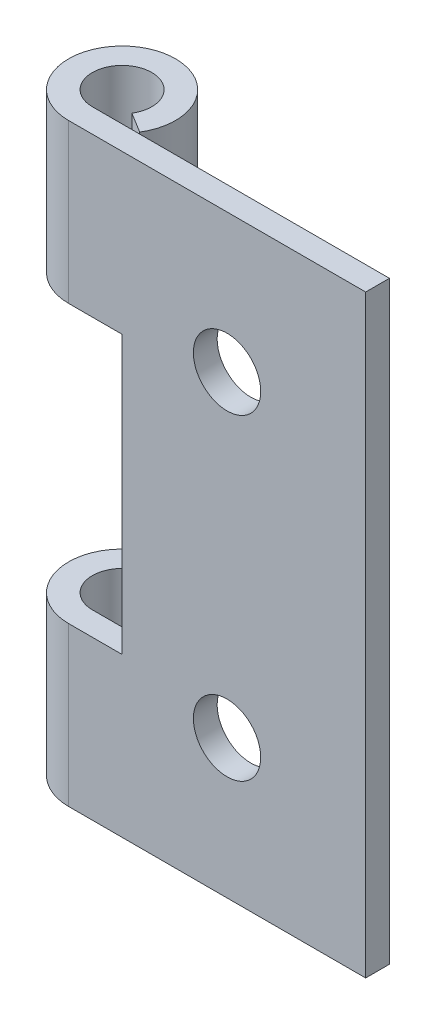
ISO-10303-21;
HEADER;
FILE_DESCRIPTION(('STEP AP214'),'2;1');
FILE_NAME('part.step','',(''),(''),'','','');
FILE_SCHEMA(('AUTOMOTIVE_DESIGN { 1 0 10303 214 1 1 1 1 }'));
ENDSEC;
DATA;
#1=APPLICATION_CONTEXT('core data for automotive mechanical design processes');
#2=APPLICATION_PROTOCOL_DEFINITION('international standard','automotive_design',2000,#1);
#3=PRODUCT_CONTEXT('',#1,'mechanical');
#4=PRODUCT('Part','Part','',(#3));
#5=PRODUCT_RELATED_PRODUCT_CATEGORY('part','',(#4));
#6=PRODUCT_DEFINITION_FORMATION('','',#4);
#7=PRODUCT_DEFINITION_CONTEXT('part definition',#1,'design');
#8=PRODUCT_DEFINITION('design','',#6,#7);
#9=PRODUCT_DEFINITION_SHAPE('','',#8);
#10=(LENGTH_UNIT() NAMED_UNIT(*) SI_UNIT(.MILLI.,.METRE.));
#11=(NAMED_UNIT(*) PLANE_ANGLE_UNIT() SI_UNIT($,.RADIAN.));
#12=(NAMED_UNIT(*) SI_UNIT($,.STERADIAN.) SOLID_ANGLE_UNIT());
#13=UNCERTAINTY_MEASURE_WITH_UNIT(LENGTH_MEASURE(1.E-05),#10,'distance_accuracy_value','');
#14=(GEOMETRIC_REPRESENTATION_CONTEXT(3) GLOBAL_UNCERTAINTY_ASSIGNED_CONTEXT((#13)) GLOBAL_UNIT_ASSIGNED_CONTEXT((#10,
#11,#12)) REPRESENTATION_CONTEXT('',''));
#15=CARTESIAN_POINT('',(0.,0.,0.));
#16=DIRECTION('',(0.,0.,1.));
#17=DIRECTION('',(1.,0.,0.));
#18=AXIS2_PLACEMENT_3D('',#15,#16,#17);
#19=CARTESIAN_POINT('',(0.,-30.,0.599999999999999));
#20=DIRECTION('',(0.,0.,1.));
#21=DIRECTION('',(1.,0.,0.));
#22=AXIS2_PLACEMENT_3D('',#19,#20,#21);
#23=PLANE('',#22);
#24=CARTESIAN_POINT('',(8.,-23.,0.599999999999999));
#25=DIRECTION('',(0.,0.,-1.));
#26=DIRECTION('',(-1.,0.,0.));
#27=AXIS2_PLACEMENT_3D('',#24,#25,#26);
#28=CIRCLE('',#27,1.7);
#29=CARTESIAN_POINT('',(6.3,-23.,0.599999999999999));
#30=VERTEX_POINT('',#29);
#31=EDGE_CURVE('E208',#30,#30,#28,.T.);
#32=ORIENTED_EDGE('',*,*,#31,.T.);
#33=EDGE_LOOP('',(#32));
#34=FACE_BOUND('',#33,.T.);
#35=CARTESIAN_POINT('',(8.,-7.,0.599999999999999));
#36=DIRECTION('',(0.,0.,-1.));
#37=DIRECTION('',(-1.,0.,0.));
#38=AXIS2_PLACEMENT_3D('',#35,#36,#37);
#39=CIRCLE('',#38,1.7);
#40=CARTESIAN_POINT('',(6.3,-7.,0.599999999999999));
#41=VERTEX_POINT('',#40);
#42=EDGE_CURVE('E250',#41,#41,#39,.T.);
#43=ORIENTED_EDGE('',*,*,#42,.T.);
#44=EDGE_LOOP('',(#43));
#45=FACE_BOUND('',#44,.T.);
#46=DIRECTION('',(0.,1.,0.));
#47=VECTOR('',#46,1.);
#48=CARTESIAN_POINT('',(0.,-30.,0.599999999999999));
#49=LINE('',#48,#47);
#50=CARTESIAN_POINT('',(0.,-8.,0.599999999999999));
#51=VERTEX_POINT('',#50);
#52=CARTESIAN_POINT('',(0.,0.,0.599999999999999));
#53=VERTEX_POINT('',#52);
#54=EDGE_CURVE('E122',#51,#53,#49,.T.);
#55=ORIENTED_EDGE('',*,*,#54,.F.);
#56=DIRECTION('',(-1.,0.,0.));
#57=VECTOR('',#56,1.);
#58=CARTESIAN_POINT('',(0.,-8.,0.599999999999999));
#59=LINE('',#58,#57);
#60=CARTESIAN_POINT('',(2.7,-8.,0.599999999999999));
#61=VERTEX_POINT('',#60);
#62=EDGE_CURVE('E184',#61,#51,#59,.T.);
#63=ORIENTED_EDGE('',*,*,#62,.F.);
#64=DIRECTION('',(0.,-1.,0.));
#65=VECTOR('',#64,1.);
#66=CARTESIAN_POINT('',(2.7,-8.,0.599999999999999));
#67=LINE('',#66,#65);
#68=CARTESIAN_POINT('',(2.7,-22.,0.599999999999999));
#69=VERTEX_POINT('',#68);
#70=EDGE_CURVE('E147',#61,#69,#67,.T.);
#71=ORIENTED_EDGE('',*,*,#70,.T.);
#72=DIRECTION('',(-1.,0.,0.));
#73=VECTOR('',#72,1.);
#74=CARTESIAN_POINT('',(0.,-22.,0.599999999999999));
#75=LINE('',#74,#73);
#76=CARTESIAN_POINT('',(0.,-22.,0.599999999999999));
#77=VERTEX_POINT('',#76);
#78=EDGE_CURVE('E211',#69,#77,#75,.T.);
#79=ORIENTED_EDGE('',*,*,#78,.T.);
#80=CARTESIAN_POINT('',(0.,-30.,0.599999999999999));
#81=VERTEX_POINT('',#80);
#82=EDGE_CURVE('E48',#81,#77,#49,.T.);
#83=ORIENTED_EDGE('',*,*,#82,.F.);
#84=DIRECTION('',(1.,0.,0.));
#85=VECTOR('',#84,1.);
#86=CARTESIAN_POINT('',(0.,-30.,0.599999999999999));
#87=LINE('',#86,#85);
#88=CARTESIAN_POINT('',(15.,-30.,0.599999999999998));
#89=VERTEX_POINT('',#88);
#90=EDGE_CURVE('E131',#81,#89,#87,.T.);
#91=ORIENTED_EDGE('',*,*,#90,.T.);
#92=DIRECTION('',(0.,1.,0.));
#93=VECTOR('',#92,1.);
#94=CARTESIAN_POINT('',(15.,-30.,0.599999999999998));
#95=LINE('',#94,#93);
#96=CARTESIAN_POINT('',(15.,0.,0.599999999999998));
#97=VERTEX_POINT('',#96);
#98=EDGE_CURVE('E11',#89,#97,#95,.T.);
#99=ORIENTED_EDGE('',*,*,#98,.T.);
#100=DIRECTION('',(1.,0.,0.));
#101=VECTOR('',#100,1.);
#102=CARTESIAN_POINT('',(0.,0.,0.599999999999999));
#103=LINE('',#102,#101);
#104=EDGE_CURVE('E159',#53,#97,#103,.T.);
#105=ORIENTED_EDGE('',*,*,#104,.F.);
#106=EDGE_LOOP('',(#55,#63,#71,#79,#83,#91,#99,#105));
#107=FACE_BOUND('',#106,.T.);
#108=ADVANCED_FACE('F39',(#34,#45,#107),#23,.T.);
#109=CARTESIAN_POINT('',(0.,-30.,-2.1));
#110=DIRECTION('',(0.,1.,0.));
#111=DIRECTION('',(0.,0.,1.));
#112=AXIS2_PLACEMENT_3D('',#109,#110,#111);
#113=CYLINDRICAL_SURFACE('',#112,2.7);
#114=DIRECTION('',(0.,1.,0.));
#115=VECTOR('',#114,1.);
#116=CARTESIAN_POINT('',(2.30184189566561,-30.,-0.688786377844038));
#117=LINE('',#116,#115);
#118=CARTESIAN_POINT('',(2.30184189566561,-8.,-0.688786377844038));
#119=VERTEX_POINT('',#118);
#120=CARTESIAN_POINT('',(2.30184189566561,0.,-0.688786377844038));
#121=VERTEX_POINT('',#120);
#122=EDGE_CURVE('E123',#119,#121,#117,.T.);
#123=ORIENTED_EDGE('',*,*,#122,.F.);
#124=CARTESIAN_POINT('',(0.,-8.,-2.1));
#125=DIRECTION('',(0.,-1.,0.));
#126=DIRECTION('',(0.,0.,-1.));
#127=AXIS2_PLACEMENT_3D('',#124,#125,#126);
#128=CIRCLE('',#127,2.7);
#129=EDGE_CURVE('E192',#51,#119,#128,.T.);
#130=ORIENTED_EDGE('',*,*,#129,.F.);
#131=ORIENTED_EDGE('',*,*,#54,.T.);
#132=CARTESIAN_POINT('',(0.,0.,-2.1));
#133=DIRECTION('',(0.,1.,0.));
#134=DIRECTION('',(0.,0.,1.));
#135=AXIS2_PLACEMENT_3D('',#132,#133,#134);
#136=CIRCLE('',#135,2.7);
#137=EDGE_CURVE('E156',#121,#53,#136,.T.);
#138=ORIENTED_EDGE('',*,*,#137,.F.);
#139=EDGE_LOOP('',(#123,#130,#131,#138));
#140=FACE_BOUND('',#139,.T.);
#141=ADVANCED_FACE('F190',(#140),#113,.T.);
#142=CARTESIAN_POINT('',(2.30184189566561,-30.,-0.688786377844038));
#143=DIRECTION('',(-0.522671711909616,0.,0.852534035431707));
#144=DIRECTION('',(0.852534035431707,0.,0.522671711909616));
#145=AXIS2_PLACEMENT_3D('',#142,#143,#144);
#146=PLANE('',#145);
#147=DIRECTION('',(0.,1.,0.));
#148=VECTOR('',#147,1.);
#149=CARTESIAN_POINT('',(1.27880105314756,-30.,-1.31599243213558));
#150=LINE('',#149,#148);
#151=CARTESIAN_POINT('',(1.27880105314756,-8.,-1.31599243213558));
#152=VERTEX_POINT('',#151);
#153=CARTESIAN_POINT('',(1.27880105314756,0.,-1.31599243213558));
#154=VERTEX_POINT('',#153);
#155=EDGE_CURVE('E164',#152,#154,#150,.T.);
#156=ORIENTED_EDGE('',*,*,#155,.F.);
#157=DIRECTION('',(-0.852534035431707,0.,-0.522671711909616));
#158=VECTOR('',#157,1.);
#159=CARTESIAN_POINT('',(1.27880105314756,-8.,-1.31599243213558));
#160=LINE('',#159,#158);
#161=EDGE_CURVE('E196',#119,#152,#160,.T.);
#162=ORIENTED_EDGE('',*,*,#161,.F.);
#163=ORIENTED_EDGE('',*,*,#122,.T.);
#164=DIRECTION('',(0.852534035431707,0.,0.522671711909616));
#165=VECTOR('',#164,1.);
#166=CARTESIAN_POINT('',(2.30184189566561,0.,-0.688786377844038));
#167=LINE('',#166,#165);
#168=EDGE_CURVE('E153',#154,#121,#167,.T.);
#169=ORIENTED_EDGE('',*,*,#168,.F.);
#170=EDGE_LOOP('',(#156,#162,#163,#169));
#171=FACE_BOUND('',#170,.T.);
#172=ADVANCED_FACE('F290',(#171),#146,.T.);
#173=CARTESIAN_POINT('',(0.,-30.,-2.1));
#174=DIRECTION('',(0.,1.,0.));
#175=DIRECTION('',(0.,0.,1.));
#176=AXIS2_PLACEMENT_3D('',#173,#174,#175);
#177=CYLINDRICAL_SURFACE('',#176,1.5);
#178=DIRECTION('',(0.,1.,0.));
#179=VECTOR('',#178,1.);
#180=CARTESIAN_POINT('',(0.,-30.,-0.600000000000001));
#181=LINE('',#180,#179);
#182=CARTESIAN_POINT('',(0.,-8.,-0.600000000000001));
#183=VERTEX_POINT('',#182);
#184=CARTESIAN_POINT('',(0.,0.,-0.600000000000001));
#185=VERTEX_POINT('',#184);
#186=EDGE_CURVE('E167',#183,#185,#181,.T.);
#187=ORIENTED_EDGE('',*,*,#186,.F.);
#188=CARTESIAN_POINT('',(0.,-8.,-2.1));
#189=DIRECTION('',(0.,1.,0.));
#190=DIRECTION('',(0.,0.,-1.));
#191=AXIS2_PLACEMENT_3D('',#188,#189,#190);
#192=CIRCLE('',#191,1.5);
#193=EDGE_CURVE('E217',#152,#183,#192,.T.);
#194=ORIENTED_EDGE('',*,*,#193,.F.);
#195=ORIENTED_EDGE('',*,*,#155,.T.);
#196=CARTESIAN_POINT('',(0.,0.,-2.1));
#197=DIRECTION('',(0.,-1.,0.));
#198=DIRECTION('',(0.,0.,1.));
#199=AXIS2_PLACEMENT_3D('',#196,#197,#198);
#200=CIRCLE('',#199,1.5);
#201=EDGE_CURVE('E150',#185,#154,#200,.T.);
#202=ORIENTED_EDGE('',*,*,#201,.F.);
#203=EDGE_LOOP('',(#187,#194,#195,#202));
#204=FACE_BOUND('',#203,.T.);
#205=ADVANCED_FACE('F273',(#204),#177,.F.);
#206=CARTESIAN_POINT('',(0.,-30.,-0.600000000000001));
#207=DIRECTION('',(0.,0.,-1.));
#208=DIRECTION('',(-1.,0.,0.));
#209=AXIS2_PLACEMENT_3D('',#206,#207,#208);
#210=PLANE('',#209);
#211=CARTESIAN_POINT('',(8.,-23.,-0.600000000000001));
#212=DIRECTION('',(0.,0.,-1.));
#213=DIRECTION('',(-1.,0.,0.));
#214=AXIS2_PLACEMENT_3D('',#211,#212,#213);
#215=CIRCLE('',#214,1.7);
#216=CARTESIAN_POINT('',(6.3,-23.,-0.600000000000001));
#217=VERTEX_POINT('',#216);
#218=EDGE_CURVE('E256',#217,#217,#215,.T.);
#219=ORIENTED_EDGE('',*,*,#218,.F.);
#220=EDGE_LOOP('',(#219));
#221=FACE_BOUND('',#220,.T.);
#222=CARTESIAN_POINT('',(8.,-7.,-0.600000000000001));
#223=DIRECTION('',(0.,0.,-1.));
#224=DIRECTION('',(-1.,0.,0.));
#225=AXIS2_PLACEMENT_3D('',#222,#223,#224);
#226=CIRCLE('',#225,1.7);
#227=CARTESIAN_POINT('',(6.3,-7.,-0.600000000000001));
#228=VERTEX_POINT('',#227);
#229=EDGE_CURVE('E253',#228,#228,#226,.T.);
#230=ORIENTED_EDGE('',*,*,#229,.F.);
#231=EDGE_LOOP('',(#230));
#232=FACE_BOUND('',#231,.T.);
#233=DIRECTION('',(0.,-1.,0.));
#234=VECTOR('',#233,1.);
#235=CARTESIAN_POINT('',(2.7,-8.,-0.600000000000001));
#236=LINE('',#235,#234);
#237=CARTESIAN_POINT('',(2.7,-8.,-0.600000000000001));
#238=VERTEX_POINT('',#237);
#239=CARTESIAN_POINT('',(2.7,-22.,-0.600000000000001));
#240=VERTEX_POINT('',#239);
#241=EDGE_CURVE('E198',#238,#240,#236,.T.);
#242=ORIENTED_EDGE('',*,*,#241,.F.);
#243=DIRECTION('',(1.,0.,0.));
#244=VECTOR('',#243,1.);
#245=CARTESIAN_POINT('',(0.,-8.,-0.600000000000001));
#246=LINE('',#245,#244);
#247=EDGE_CURVE('E244',#183,#238,#246,.T.);
#248=ORIENTED_EDGE('',*,*,#247,.F.);
#249=ORIENTED_EDGE('',*,*,#186,.T.);
#250=DIRECTION('',(-1.,0.,0.));
#251=VECTOR('',#250,1.);
#252=CARTESIAN_POINT('',(0.,0.,-0.600000000000001));
#253=LINE('',#252,#251);
#254=CARTESIAN_POINT('',(15.,0.,-0.600000000000002));
#255=VERTEX_POINT('',#254);
#256=EDGE_CURVE('E146',#255,#185,#253,.T.);
#257=ORIENTED_EDGE('',*,*,#256,.F.);
#258=DIRECTION('',(0.,1.,0.));
#259=VECTOR('',#258,1.);
#260=CARTESIAN_POINT('',(15.,-30.,-0.600000000000002));
#261=LINE('',#260,#259);
#262=CARTESIAN_POINT('',(15.,-30.,-0.600000000000002));
#263=VERTEX_POINT('',#262);
#264=EDGE_CURVE('E43',#263,#255,#261,.T.);
#265=ORIENTED_EDGE('',*,*,#264,.F.);
#266=DIRECTION('',(-1.,0.,0.));
#267=VECTOR('',#266,1.);
#268=CARTESIAN_POINT('',(0.,-30.,-0.600000000000001));
#269=LINE('',#268,#267);
#270=CARTESIAN_POINT('',(0.,-30.,-0.600000000000001));
#271=VERTEX_POINT('',#270);
#272=EDGE_CURVE('E138',#263,#271,#269,.T.);
#273=ORIENTED_EDGE('',*,*,#272,.T.);
#274=CARTESIAN_POINT('',(0.,-22.,-0.600000000000001));
#275=VERTEX_POINT('',#274);
#276=EDGE_CURVE('E165',#271,#275,#181,.T.);
#277=ORIENTED_EDGE('',*,*,#276,.T.);
#278=DIRECTION('',(1.,0.,0.));
#279=VECTOR('',#278,1.);
#280=CARTESIAN_POINT('',(0.,-22.,-0.600000000000001));
#281=LINE('',#280,#279);
#282=EDGE_CURVE('E207',#275,#240,#281,.T.);
#283=ORIENTED_EDGE('',*,*,#282,.T.);
#284=EDGE_LOOP('',(#242,#248,#249,#257,#265,#273,#277,#283));
#285=FACE_BOUND('',#284,.T.);
#286=ADVANCED_FACE('F174',(#221,#232,#285),#210,.T.);
#287=CARTESIAN_POINT('',(15.,-30.,-0.600000000000002));
#288=DIRECTION('',(1.,0.,0.));
#289=DIRECTION('',(0.,0.,-1.));
#290=AXIS2_PLACEMENT_3D('',#287,#288,#289);
#291=PLANE('',#290);
#292=DIRECTION('',(0.,0.,-1.));
#293=VECTOR('',#292,1.);
#294=CARTESIAN_POINT('',(15.,0.,-0.600000000000002));
#295=LINE('',#294,#293);
#296=EDGE_CURVE('E143',#97,#255,#295,.T.);
#297=ORIENTED_EDGE('',*,*,#296,.F.);
#298=ORIENTED_EDGE('',*,*,#98,.F.);
#299=DIRECTION('',(0.,0.,-1.));
#300=VECTOR('',#299,1.);
#301=CARTESIAN_POINT('',(15.,-30.,-0.600000000000002));
#302=LINE('',#301,#300);
#303=EDGE_CURVE('E161',#89,#263,#302,.T.);
#304=ORIENTED_EDGE('',*,*,#303,.T.);
#305=ORIENTED_EDGE('',*,*,#264,.T.);
#306=EDGE_LOOP('',(#297,#298,#304,#305));
#307=FACE_BOUND('',#306,.T.);
#308=ADVANCED_FACE('F41',(#307),#291,.T.);
#309=CARTESIAN_POINT('',(0.,-22.,-2.1));
#310=DIRECTION('',(0.,-1.,0.));
#311=DIRECTION('',(0.,0.,-1.));
#312=AXIS2_PLACEMENT_3D('',#309,#310,#311);
#313=CIRCLE('',#312,2.7);
#314=CARTESIAN_POINT('',(2.30184189566561,-22.,-0.688786377844038));
#315=VERTEX_POINT('',#314);
#316=EDGE_CURVE('E118',#77,#315,#313,.T.);
#317=ORIENTED_EDGE('',*,*,#316,.T.);
#318=CARTESIAN_POINT('',(2.30184189566561,-30.,-0.688786377844038));
#319=VERTEX_POINT('',#318);
#320=EDGE_CURVE('E110',#319,#315,#117,.T.);
#321=ORIENTED_EDGE('',*,*,#320,.F.);
#322=CARTESIAN_POINT('',(0.,-30.,-2.1));
#323=DIRECTION('',(0.,1.,0.));
#324=DIRECTION('',(0.,0.,1.));
#325=AXIS2_PLACEMENT_3D('',#322,#323,#324);
#326=CIRCLE('',#325,2.7);
#327=EDGE_CURVE('E114',#319,#81,#326,.T.);
#328=ORIENTED_EDGE('',*,*,#327,.T.);
#329=ORIENTED_EDGE('',*,*,#82,.T.);
#330=EDGE_LOOP('',(#317,#321,#328,#329));
#331=FACE_BOUND('',#330,.T.);
#332=ADVANCED_FACE('F112',(#331),#113,.T.);
#333=DIRECTION('',(-0.852534035431707,0.,-0.522671711909616));
#334=VECTOR('',#333,1.);
#335=CARTESIAN_POINT('',(1.27880105314756,-22.,-1.31599243213558));
#336=LINE('',#335,#334);
#337=CARTESIAN_POINT('',(1.27880105314756,-22.,-1.31599243213558));
#338=VERTEX_POINT('',#337);
#339=EDGE_CURVE('E215',#315,#338,#336,.T.);
#340=ORIENTED_EDGE('',*,*,#339,.T.);
#341=CARTESIAN_POINT('',(1.27880105314756,-30.,-1.31599243213558));
#342=VERTEX_POINT('',#341);
#343=EDGE_CURVE('E135',#342,#338,#150,.T.);
#344=ORIENTED_EDGE('',*,*,#343,.F.);
#345=DIRECTION('',(0.852534035431707,0.,0.522671711909616));
#346=VECTOR('',#345,1.);
#347=CARTESIAN_POINT('',(2.30184189566561,-30.,-0.688786377844038));
#348=LINE('',#347,#346);
#349=EDGE_CURVE('E129',#342,#319,#348,.T.);
#350=ORIENTED_EDGE('',*,*,#349,.T.);
#351=ORIENTED_EDGE('',*,*,#320,.T.);
#352=EDGE_LOOP('',(#340,#344,#350,#351));
#353=FACE_BOUND('',#352,.T.);
#354=ADVANCED_FACE('F133',(#353),#146,.T.);
#355=CARTESIAN_POINT('',(0.,-22.,-2.1));
#356=DIRECTION('',(0.,1.,0.));
#357=DIRECTION('',(0.,0.,-1.));
#358=AXIS2_PLACEMENT_3D('',#355,#356,#357);
#359=CIRCLE('',#358,1.5);
#360=EDGE_CURVE('E204',#338,#275,#359,.T.);
#361=ORIENTED_EDGE('',*,*,#360,.T.);
#362=ORIENTED_EDGE('',*,*,#276,.F.);
#363=CARTESIAN_POINT('',(0.,-30.,-2.1));
#364=DIRECTION('',(0.,-1.,0.));
#365=DIRECTION('',(0.,0.,1.));
#366=AXIS2_PLACEMENT_3D('',#363,#364,#365);
#367=CIRCLE('',#366,1.5);
#368=EDGE_CURVE('E136',#271,#342,#367,.T.);
#369=ORIENTED_EDGE('',*,*,#368,.T.);
#370=ORIENTED_EDGE('',*,*,#343,.T.);
#371=EDGE_LOOP('',(#361,#362,#369,#370));
#372=FACE_BOUND('',#371,.T.);
#373=ADVANCED_FACE('F221',(#372),#177,.F.);
#374=CARTESIAN_POINT('',(0.,-30.,-2.1));
#375=DIRECTION('',(0.,1.,0.));
#376=DIRECTION('',(0.,0.,1.));
#377=AXIS2_PLACEMENT_3D('',#374,#375,#376);
#378=PLANE('',#377);
#379=ORIENTED_EDGE('',*,*,#303,.F.);
#380=ORIENTED_EDGE('',*,*,#90,.F.);
#381=ORIENTED_EDGE('',*,*,#327,.F.);
#382=ORIENTED_EDGE('',*,*,#349,.F.);
#383=ORIENTED_EDGE('',*,*,#368,.F.);
#384=ORIENTED_EDGE('',*,*,#272,.F.);
#385=EDGE_LOOP('',(#379,#380,#381,#382,#383,#384));
#386=FACE_BOUND('',#385,.T.);
#387=ADVANCED_FACE('F127',(#386),#378,.F.);
#388=CARTESIAN_POINT('',(0.,0.,-2.1));
#389=DIRECTION('',(0.,1.,0.));
#390=DIRECTION('',(0.,0.,1.));
#391=AXIS2_PLACEMENT_3D('',#388,#389,#390);
#392=PLANE('',#391);
#393=ORIENTED_EDGE('',*,*,#296,.T.);
#394=ORIENTED_EDGE('',*,*,#256,.T.);
#395=ORIENTED_EDGE('',*,*,#201,.T.);
#396=ORIENTED_EDGE('',*,*,#168,.T.);
#397=ORIENTED_EDGE('',*,*,#137,.T.);
#398=ORIENTED_EDGE('',*,*,#104,.T.);
#399=EDGE_LOOP('',(#393,#394,#395,#396,#397,#398));
#400=FACE_BOUND('',#399,.T.);
#401=ADVANCED_FACE('F176',(#400),#392,.T.);
#402=CARTESIAN_POINT('',(2.7,-8.,-0.600000000000001));
#403=DIRECTION('',(1.,0.,0.));
#404=DIRECTION('',(0.,0.,-1.));
#405=AXIS2_PLACEMENT_3D('',#402,#403,#404);
#406=PLANE('',#405);
#407=DIRECTION('',(0.,0.,1.));
#408=VECTOR('',#407,1.);
#409=CARTESIAN_POINT('',(2.7,-22.,-0.600000000000001));
#410=LINE('',#409,#408);
#411=EDGE_CURVE('E56',#240,#69,#410,.T.);
#412=ORIENTED_EDGE('',*,*,#411,.T.);
#413=ORIENTED_EDGE('',*,*,#70,.F.);
#414=DIRECTION('',(0.,0.,1.));
#415=VECTOR('',#414,1.);
#416=CARTESIAN_POINT('',(2.7,-8.,-0.600000000000001));
#417=LINE('',#416,#415);
#418=EDGE_CURVE('E200',#238,#61,#417,.T.);
#419=ORIENTED_EDGE('',*,*,#418,.F.);
#420=ORIENTED_EDGE('',*,*,#241,.T.);
#421=EDGE_LOOP('',(#412,#413,#419,#420));
#422=FACE_BOUND('',#421,.T.);
#423=ADVANCED_FACE('F243',(#422),#406,.F.);
#424=CARTESIAN_POINT('',(0.,-8.,-2.1));
#425=DIRECTION('',(0.,-1.,0.));
#426=DIRECTION('',(0.,0.,-1.));
#427=AXIS2_PLACEMENT_3D('',#424,#425,#426);
#428=PLANE('',#427);
#429=ORIENTED_EDGE('',*,*,#193,.T.);
#430=ORIENTED_EDGE('',*,*,#247,.T.);
#431=ORIENTED_EDGE('',*,*,#418,.T.);
#432=ORIENTED_EDGE('',*,*,#62,.T.);
#433=ORIENTED_EDGE('',*,*,#129,.T.);
#434=ORIENTED_EDGE('',*,*,#161,.T.);
#435=EDGE_LOOP('',(#429,#430,#431,#432,#433,#434));
#436=FACE_BOUND('',#435,.T.);
#437=ADVANCED_FACE('F245',(#436),#428,.T.);
#438=CARTESIAN_POINT('',(0.,-22.,-2.1));
#439=DIRECTION('',(0.,-1.,0.));
#440=DIRECTION('',(0.,0.,-1.));
#441=AXIS2_PLACEMENT_3D('',#438,#439,#440);
#442=PLANE('',#441);
#443=ORIENTED_EDGE('',*,*,#360,.F.);
#444=ORIENTED_EDGE('',*,*,#339,.F.);
#445=ORIENTED_EDGE('',*,*,#316,.F.);
#446=ORIENTED_EDGE('',*,*,#78,.F.);
#447=ORIENTED_EDGE('',*,*,#411,.F.);
#448=ORIENTED_EDGE('',*,*,#282,.F.);
#449=EDGE_LOOP('',(#443,#444,#445,#446,#447,#448));
#450=FACE_BOUND('',#449,.T.);
#451=ADVANCED_FACE('F226',(#450),#442,.F.);
#452=CARTESIAN_POINT('',(8.,-7.,0.599999999999999));
#453=DIRECTION('',(0.,0.,-1.));
#454=DIRECTION('',(-1.,0.,0.));
#455=AXIS2_PLACEMENT_3D('',#452,#453,#454);
#456=CYLINDRICAL_SURFACE('',#455,1.7);
#457=ORIENTED_EDGE('',*,*,#42,.F.);
#458=EDGE_LOOP('',(#457));
#459=FACE_BOUND('',#458,.T.);
#460=ORIENTED_EDGE('',*,*,#229,.T.);
#461=EDGE_LOOP('',(#460));
#462=FACE_BOUND('',#461,.T.);
#463=ADVANCED_FACE('F267',(#459,#462),#456,.F.);
#464=CARTESIAN_POINT('',(8.,-23.,0.599999999999999));
#465=DIRECTION('',(0.,0.,-1.));
#466=DIRECTION('',(-1.,0.,0.));
#467=AXIS2_PLACEMENT_3D('',#464,#465,#466);
#468=CYLINDRICAL_SURFACE('',#467,1.7);
#469=ORIENTED_EDGE('',*,*,#31,.F.);
#470=EDGE_LOOP('',(#469));
#471=FACE_BOUND('',#470,.T.);
#472=ORIENTED_EDGE('',*,*,#218,.T.);
#473=EDGE_LOOP('',(#472));
#474=FACE_BOUND('',#473,.T.);
#475=ADVANCED_FACE('F264',(#471,#474),#468,.F.);
#476=CLOSED_SHELL('',(#108,#141,#172,#205,#286,#308,#332,#354,#373,#387,#401,#423,#437,#451,
#463,#475));
#477=MANIFOLD_SOLID_BREP('B2',#476);
#478=ADVANCED_BREP_SHAPE_REPRESENTATION('',(#18,#477),#14);
#479=SHAPE_DEFINITION_REPRESENTATION(#9,#478);
ENDSEC;
END-ISO-10303-21;
